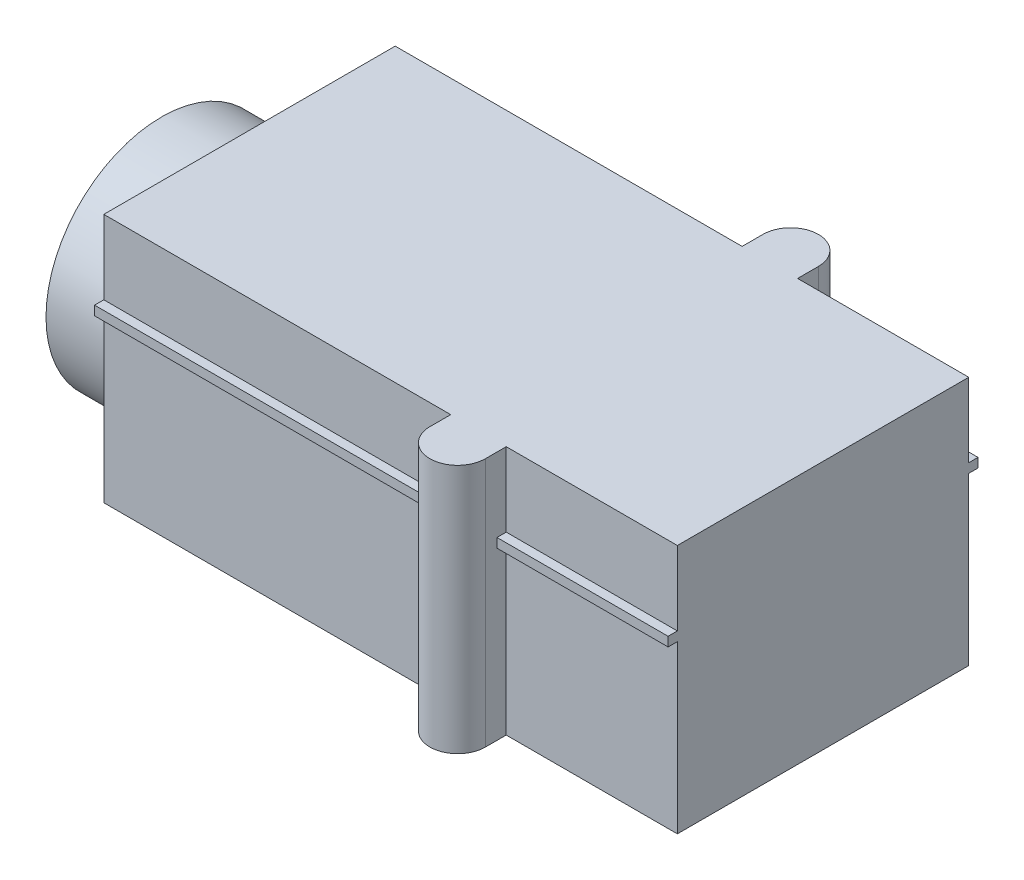
ISO-10303-21;
HEADER;
FILE_DESCRIPTION(('STEP AP214'),'2;1');
FILE_NAME('part.step','',(''),(''),'','','');
FILE_SCHEMA(('AUTOMOTIVE_DESIGN { 1 0 10303 214 1 1 1 1 }'));
ENDSEC;
DATA;
#1=APPLICATION_CONTEXT('core data for automotive mechanical design processes');
#2=APPLICATION_PROTOCOL_DEFINITION('international standard','automotive_design',2000,#1);
#3=PRODUCT_CONTEXT('',#1,'mechanical');
#4=PRODUCT('Part','Part','',(#3));
#5=PRODUCT_RELATED_PRODUCT_CATEGORY('part','',(#4));
#6=PRODUCT_DEFINITION_FORMATION('','',#4);
#7=PRODUCT_DEFINITION_CONTEXT('part definition',#1,'design');
#8=PRODUCT_DEFINITION('design','',#6,#7);
#9=PRODUCT_DEFINITION_SHAPE('','',#8);
#10=(LENGTH_UNIT() NAMED_UNIT(*) SI_UNIT(.MILLI.,.METRE.));
#11=(NAMED_UNIT(*) PLANE_ANGLE_UNIT() SI_UNIT($,.RADIAN.));
#12=(NAMED_UNIT(*) SI_UNIT($,.STERADIAN.) SOLID_ANGLE_UNIT());
#13=UNCERTAINTY_MEASURE_WITH_UNIT(LENGTH_MEASURE(1.E-05),#10,'distance_accuracy_value','');
#14=(GEOMETRIC_REPRESENTATION_CONTEXT(3) GLOBAL_UNCERTAINTY_ASSIGNED_CONTEXT((#13)) GLOBAL_UNIT_ASSIGNED_CONTEXT((#10,
#11,#12)) REPRESENTATION_CONTEXT('',''));
#15=CARTESIAN_POINT('',(0.,0.,0.));
#16=DIRECTION('',(0.,0.,1.));
#17=DIRECTION('',(1.,0.,0.));
#18=AXIS2_PLACEMENT_3D('',#15,#16,#17);
#19=CARTESIAN_POINT('',(7.5,5.4,3.15));
#20=DIRECTION('',(0.,0.,-1.));
#21=DIRECTION('',(-1.,0.,0.));
#22=AXIS2_PLACEMENT_3D('',#19,#20,#21);
#23=PLANE('',#22);
#24=DIRECTION('',(1.,0.,0.));
#25=VECTOR('',#24,1.);
#26=CARTESIAN_POINT('',(7.5,3.6,3.15));
#27=LINE('',#26,#25);
#28=CARTESIAN_POINT('',(0.,3.6,3.15));
#29=VERTEX_POINT('',#28);
#30=CARTESIAN_POINT('',(7.5,3.6,3.15));
#31=VERTEX_POINT('',#30);
#32=EDGE_CURVE('E47',#29,#31,#27,.T.);
#33=ORIENTED_EDGE('',*,*,#32,.F.);
#34=DIRECTION('',(0.,-1.,0.));
#35=VECTOR('',#34,1.);
#36=CARTESIAN_POINT('',(0.,5.4,3.15));
#37=LINE('',#36,#35);
#38=CARTESIAN_POINT('',(0.,0.,3.15));
#39=VERTEX_POINT('',#38);
#40=EDGE_CURVE('E354',#29,#39,#37,.T.);
#41=ORIENTED_EDGE('',*,*,#40,.T.);
#42=DIRECTION('',(1.,0.,0.));
#43=VECTOR('',#42,1.);
#44=CARTESIAN_POINT('',(7.5,0.,3.15));
#45=LINE('',#44,#43);
#46=CARTESIAN_POINT('',(7.5,0.,3.15));
#47=VERTEX_POINT('',#46);
#48=EDGE_CURVE('E324',#39,#47,#45,.T.);
#49=ORIENTED_EDGE('',*,*,#48,.T.);
#50=DIRECTION('',(0.,-1.,0.));
#51=VECTOR('',#50,1.);
#52=CARTESIAN_POINT('',(7.5,5.4,3.15));
#53=LINE('',#52,#51);
#54=EDGE_CURVE('E421',#31,#47,#53,.T.);
#55=ORIENTED_EDGE('',*,*,#54,.F.);
#56=EDGE_LOOP('',(#33,#41,#49,#55));
#57=FACE_BOUND('',#56,.T.);
#58=ADVANCED_FACE('F32',(#57),#23,.F.);
#59=CARTESIAN_POINT('',(12.4,5.4,3.15));
#60=DIRECTION('',(0.,0.,-1.));
#61=DIRECTION('',(-1.,0.,0.));
#62=AXIS2_PLACEMENT_3D('',#59,#60,#61);
#63=PLANE('',#62);
#64=DIRECTION('',(1.,0.,0.));
#65=VECTOR('',#64,1.);
#66=CARTESIAN_POINT('',(12.4,3.6,3.15));
#67=LINE('',#66,#65);
#68=CARTESIAN_POINT('',(8.7,3.6,3.15));
#69=VERTEX_POINT('',#68);
#70=CARTESIAN_POINT('',(12.4,3.6,3.15));
#71=VERTEX_POINT('',#70);
#72=EDGE_CURVE('E293',#69,#71,#67,.T.);
#73=ORIENTED_EDGE('',*,*,#72,.F.);
#74=DIRECTION('',(0.,-1.,0.));
#75=VECTOR('',#74,1.);
#76=CARTESIAN_POINT('',(8.7,5.4,3.15));
#77=LINE('',#76,#75);
#78=CARTESIAN_POINT('',(8.7,0.,3.15));
#79=VERTEX_POINT('',#78);
#80=EDGE_CURVE('E411',#69,#79,#77,.T.);
#81=ORIENTED_EDGE('',*,*,#80,.T.);
#82=DIRECTION('',(1.,0.,0.));
#83=VECTOR('',#82,1.);
#84=CARTESIAN_POINT('',(12.4,0.,3.15));
#85=LINE('',#84,#83);
#86=CARTESIAN_POINT('',(12.4,0.,3.15));
#87=VERTEX_POINT('',#86);
#88=EDGE_CURVE('E364',#79,#87,#85,.T.);
#89=ORIENTED_EDGE('',*,*,#88,.T.);
#90=DIRECTION('',(0.,-1.,0.));
#91=VECTOR('',#90,1.);
#92=CARTESIAN_POINT('',(12.4,5.4,3.15));
#93=LINE('',#92,#91);
#94=EDGE_CURVE('E407',#71,#87,#93,.T.);
#95=ORIENTED_EDGE('',*,*,#94,.F.);
#96=EDGE_LOOP('',(#73,#81,#89,#95));
#97=FACE_BOUND('',#96,.T.);
#98=ADVANCED_FACE('F501',(#97),#63,.F.);
#99=CARTESIAN_POINT('',(8.7,5.4,-3.15));
#100=DIRECTION('',(0.,0.,1.));
#101=DIRECTION('',(1.,0.,0.));
#102=AXIS2_PLACEMENT_3D('',#99,#100,#101);
#103=PLANE('',#102);
#104=DIRECTION('',(-1.,0.,0.));
#105=VECTOR('',#104,1.);
#106=CARTESIAN_POINT('',(8.7,3.6,-3.15));
#107=LINE('',#106,#105);
#108=CARTESIAN_POINT('',(12.4,3.6,-3.15));
#109=VERTEX_POINT('',#108);
#110=CARTESIAN_POINT('',(8.7,3.6,-3.15));
#111=VERTEX_POINT('',#110);
#112=EDGE_CURVE('E290',#109,#111,#107,.T.);
#113=ORIENTED_EDGE('',*,*,#112,.F.);
#114=DIRECTION('',(0.,-1.,0.));
#115=VECTOR('',#114,1.);
#116=CARTESIAN_POINT('',(12.4,5.4,-3.15));
#117=LINE('',#116,#115);
#118=CARTESIAN_POINT('',(12.4,0.,-3.15));
#119=VERTEX_POINT('',#118);
#120=EDGE_CURVE('E404',#109,#119,#117,.T.);
#121=ORIENTED_EDGE('',*,*,#120,.T.);
#122=DIRECTION('',(-1.,0.,0.));
#123=VECTOR('',#122,1.);
#124=CARTESIAN_POINT('',(8.7,0.,-3.15));
#125=LINE('',#124,#123);
#126=CARTESIAN_POINT('',(8.7,0.,-3.15));
#127=VERTEX_POINT('',#126);
#128=EDGE_CURVE('E370',#119,#127,#125,.T.);
#129=ORIENTED_EDGE('',*,*,#128,.T.);
#130=DIRECTION('',(0.,-1.,0.));
#131=VECTOR('',#130,1.);
#132=CARTESIAN_POINT('',(8.7,5.4,-3.15));
#133=LINE('',#132,#131);
#134=EDGE_CURVE('E400',#111,#127,#133,.T.);
#135=ORIENTED_EDGE('',*,*,#134,.F.);
#136=EDGE_LOOP('',(#113,#121,#129,#135));
#137=FACE_BOUND('',#136,.T.);
#138=ADVANCED_FACE('F491',(#137),#103,.F.);
#139=CARTESIAN_POINT('',(0.,5.4,-3.15));
#140=DIRECTION('',(0.,0.,1.));
#141=DIRECTION('',(1.,0.,0.));
#142=AXIS2_PLACEMENT_3D('',#139,#140,#141);
#143=PLANE('',#142);
#144=DIRECTION('',(-1.,0.,0.));
#145=VECTOR('',#144,1.);
#146=CARTESIAN_POINT('',(0.,3.6,-3.15));
#147=LINE('',#146,#145);
#148=CARTESIAN_POINT('',(7.5,3.6,-3.15));
#149=VERTEX_POINT('',#148);
#150=CARTESIAN_POINT('',(0.,3.6,-3.15));
#151=VERTEX_POINT('',#150);
#152=EDGE_CURVE('E425',#149,#151,#147,.T.);
#153=ORIENTED_EDGE('',*,*,#152,.F.);
#154=DIRECTION('',(0.,-1.,0.));
#155=VECTOR('',#154,1.);
#156=CARTESIAN_POINT('',(7.5,5.4,-3.15));
#157=LINE('',#156,#155);
#158=CARTESIAN_POINT('',(7.5,0.,-3.15));
#159=VERTEX_POINT('',#158);
#160=EDGE_CURVE('E390',#149,#159,#157,.T.);
#161=ORIENTED_EDGE('',*,*,#160,.T.);
#162=DIRECTION('',(-1.,0.,0.));
#163=VECTOR('',#162,1.);
#164=CARTESIAN_POINT('',(0.,0.,-3.15));
#165=LINE('',#164,#163);
#166=CARTESIAN_POINT('',(0.,0.,-3.15));
#167=VERTEX_POINT('',#166);
#168=EDGE_CURVE('E380',#159,#167,#165,.T.);
#169=ORIENTED_EDGE('',*,*,#168,.T.);
#170=DIRECTION('',(0.,-1.,0.));
#171=VECTOR('',#170,1.);
#172=CARTESIAN_POINT('',(0.,5.4,-3.15));
#173=LINE('',#172,#171);
#174=EDGE_CURVE('E388',#151,#167,#173,.T.);
#175=ORIENTED_EDGE('',*,*,#174,.F.);
#176=EDGE_LOOP('',(#153,#161,#169,#175));
#177=FACE_BOUND('',#176,.T.);
#178=ADVANCED_FACE('F439',(#177),#143,.F.);
#179=CARTESIAN_POINT('',(0.,5.4,3.15));
#180=DIRECTION('',(1.,0.,0.));
#181=DIRECTION('',(0.,0.,-1.));
#182=AXIS2_PLACEMENT_3D('',#179,#180,#181);
#183=PLANE('',#182);
#184=CARTESIAN_POINT('',(0.,5.4,-3.15));
#185=VERTEX_POINT('',#184);
#186=CARTESIAN_POINT('',(0.,3.8,-3.15));
#187=VERTEX_POINT('',#186);
#188=EDGE_CURVE('E233',#185,#187,#173,.T.);
#189=ORIENTED_EDGE('',*,*,#188,.T.);
#190=DIRECTION('',(0.,0.,-1.));
#191=VECTOR('',#190,1.);
#192=CARTESIAN_POINT('',(0.,3.8,-3.35));
#193=LINE('',#192,#191);
#194=CARTESIAN_POINT('',(0.,3.8,-3.35));
#195=VERTEX_POINT('',#194);
#196=EDGE_CURVE('E225',#187,#195,#193,.T.);
#197=ORIENTED_EDGE('',*,*,#196,.T.);
#198=DIRECTION('',(0.,-1.,0.));
#199=VECTOR('',#198,1.);
#200=CARTESIAN_POINT('',(0.,3.8,-3.35));
#201=LINE('',#200,#199);
#202=CARTESIAN_POINT('',(0.,3.6,-3.35));
#203=VERTEX_POINT('',#202);
#204=EDGE_CURVE('E229',#195,#203,#201,.T.);
#205=ORIENTED_EDGE('',*,*,#204,.T.);
#206=DIRECTION('',(0.,0.,-1.));
#207=VECTOR('',#206,1.);
#208=CARTESIAN_POINT('',(0.,3.6,-3.35));
#209=LINE('',#208,#207);
#210=EDGE_CURVE('E267',#151,#203,#209,.T.);
#211=ORIENTED_EDGE('',*,*,#210,.F.);
#212=ORIENTED_EDGE('',*,*,#174,.T.);
#213=DIRECTION('',(0.,0.,1.));
#214=VECTOR('',#213,1.);
#215=CARTESIAN_POINT('',(0.,0.,3.15));
#216=LINE('',#215,#214);
#217=CARTESIAN_POINT('',(0.,0.,-1.18743420870379));
#218=VERTEX_POINT('',#217);
#219=EDGE_CURVE('E332',#167,#218,#216,.T.);
#220=ORIENTED_EDGE('',*,*,#219,.T.);
#221=CARTESIAN_POINT('',(0.,2.2,0.));
#222=DIRECTION('',(-1.,0.,0.));
#223=DIRECTION('',(0.,0.,1.));
#224=AXIS2_PLACEMENT_3D('',#221,#222,#223);
#225=CIRCLE('',#224,2.5);
#226=CARTESIAN_POINT('',(0.,0.,1.18743420870379));
#227=VERTEX_POINT('',#226);
#228=EDGE_CURVE('E327',#227,#218,#225,.T.);
#229=ORIENTED_EDGE('',*,*,#228,.F.);
#230=EDGE_CURVE('E383',#227,#39,#216,.T.);
#231=ORIENTED_EDGE('',*,*,#230,.T.);
#232=ORIENTED_EDGE('',*,*,#40,.F.);
#233=CARTESIAN_POINT('',(0.,3.6,3.35));
#234=VERTEX_POINT('',#233);
#235=EDGE_CURVE('E263',#234,#29,#209,.T.);
#236=ORIENTED_EDGE('',*,*,#235,.F.);
#237=DIRECTION('',(0.,-1.,0.));
#238=VECTOR('',#237,1.);
#239=CARTESIAN_POINT('',(0.,3.8,3.35));
#240=LINE('',#239,#238);
#241=CARTESIAN_POINT('',(0.,3.8,3.35));
#242=VERTEX_POINT('',#241);
#243=EDGE_CURVE('E276',#242,#234,#240,.T.);
#244=ORIENTED_EDGE('',*,*,#243,.F.);
#245=CARTESIAN_POINT('',(0.,3.8,3.15));
#246=VERTEX_POINT('',#245);
#247=EDGE_CURVE('E237',#242,#246,#193,.T.);
#248=ORIENTED_EDGE('',*,*,#247,.T.);
#249=CARTESIAN_POINT('',(0.,5.4,3.15));
#250=VERTEX_POINT('',#249);
#251=EDGE_CURVE('E55',#250,#246,#37,.T.);
#252=ORIENTED_EDGE('',*,*,#251,.F.);
#253=DIRECTION('',(0.,0.,1.));
#254=VECTOR('',#253,1.);
#255=CARTESIAN_POINT('',(0.,5.4,3.15));
#256=LINE('',#255,#254);
#257=EDGE_CURVE('E352',#185,#250,#256,.T.);
#258=ORIENTED_EDGE('',*,*,#257,.F.);
#259=EDGE_LOOP('',(#189,#197,#205,#211,#212,#220,#229,#231,#232,#236,#244,#248,#252,#258));
#260=FACE_BOUND('',#259,.T.);
#261=ADVANCED_FACE('F227',(#260),#183,.F.);
#262=ORIENTED_EDGE('',*,*,#251,.T.);
#263=DIRECTION('',(1.,0.,0.));
#264=VECTOR('',#263,1.);
#265=CARTESIAN_POINT('',(7.5,3.8,3.15));
#266=LINE('',#265,#264);
#267=CARTESIAN_POINT('',(7.5,3.8,3.15));
#268=VERTEX_POINT('',#267);
#269=EDGE_CURVE('E314',#246,#268,#266,.T.);
#270=ORIENTED_EDGE('',*,*,#269,.T.);
#271=CARTESIAN_POINT('',(7.5,5.4,3.15));
#272=VERTEX_POINT('',#271);
#273=EDGE_CURVE('E422',#272,#268,#53,.T.);
#274=ORIENTED_EDGE('',*,*,#273,.F.);
#275=DIRECTION('',(1.,0.,0.));
#276=VECTOR('',#275,1.);
#277=CARTESIAN_POINT('',(7.5,5.4,3.15));
#278=LINE('',#277,#276);
#279=EDGE_CURVE('E328',#250,#272,#278,.T.);
#280=ORIENTED_EDGE('',*,*,#279,.F.);
#281=EDGE_LOOP('',(#262,#270,#274,#280));
#282=FACE_BOUND('',#281,.T.);
#283=ADVANCED_FACE('F34',(#282),#23,.F.);
#284=CARTESIAN_POINT('',(7.5,5.4,3.15));
#285=DIRECTION('',(1.,0.,0.));
#286=DIRECTION('',(0.,0.,-1.));
#287=AXIS2_PLACEMENT_3D('',#284,#285,#286);
#288=PLANE('',#287);
#289=ORIENTED_EDGE('',*,*,#273,.T.);
#290=DIRECTION('',(0.,0.,1.));
#291=VECTOR('',#290,1.);
#292=CARTESIAN_POINT('',(7.5,3.8,3.15));
#293=LINE('',#292,#291);
#294=CARTESIAN_POINT('',(7.5,3.8,3.35));
#295=VERTEX_POINT('',#294);
#296=EDGE_CURVE('E312',#268,#295,#293,.T.);
#297=ORIENTED_EDGE('',*,*,#296,.T.);
#298=DIRECTION('',(0.,-1.,0.));
#299=VECTOR('',#298,1.);
#300=CARTESIAN_POINT('',(7.5,5.4,3.35));
#301=LINE('',#300,#299);
#302=CARTESIAN_POINT('',(7.5,3.6,3.35));
#303=VERTEX_POINT('',#302);
#304=EDGE_CURVE('E318',#295,#303,#301,.T.);
#305=ORIENTED_EDGE('',*,*,#304,.T.);
#306=DIRECTION('',(0.,0.,1.));
#307=VECTOR('',#306,1.);
#308=CARTESIAN_POINT('',(7.5,3.6,3.15));
#309=LINE('',#308,#307);
#310=EDGE_CURVE('E299',#31,#303,#309,.T.);
#311=ORIENTED_EDGE('',*,*,#310,.F.);
#312=ORIENTED_EDGE('',*,*,#54,.T.);
#313=DIRECTION('',(0.,0.,1.));
#314=VECTOR('',#313,1.);
#315=CARTESIAN_POINT('',(7.5,0.,3.15));
#316=LINE('',#315,#314);
#317=CARTESIAN_POINT('',(7.5,0.,3.6));
#318=VERTEX_POINT('',#317);
#319=EDGE_CURVE('E357',#47,#318,#316,.T.);
#320=ORIENTED_EDGE('',*,*,#319,.T.);
#321=DIRECTION('',(0.,-1.,0.));
#322=VECTOR('',#321,1.);
#323=CARTESIAN_POINT('',(7.5,5.4,3.6));
#324=LINE('',#323,#322);
#325=CARTESIAN_POINT('',(7.5,5.4,3.6));
#326=VERTEX_POINT('',#325);
#327=EDGE_CURVE('E418',#326,#318,#324,.T.);
#328=ORIENTED_EDGE('',*,*,#327,.F.);
#329=DIRECTION('',(0.,0.,1.));
#330=VECTOR('',#329,1.);
#331=CARTESIAN_POINT('',(7.5,5.4,3.15));
#332=LINE('',#331,#330);
#333=EDGE_CURVE('E331',#272,#326,#332,.T.);
#334=ORIENTED_EDGE('',*,*,#333,.F.);
#335=EDGE_LOOP('',(#289,#297,#305,#311,#312,#320,#328,#334));
#336=FACE_BOUND('',#335,.T.);
#337=ADVANCED_FACE('F468',(#336),#288,.F.);
#338=CARTESIAN_POINT('',(8.1,5.4,3.6));
#339=DIRECTION('',(0.,-1.,0.));
#340=DIRECTION('',(0.,0.,-1.));
#341=AXIS2_PLACEMENT_3D('',#338,#339,#340);
#342=CYLINDRICAL_SURFACE('',#341,0.600000000000002);
#343=CARTESIAN_POINT('',(8.1,0.,3.6));
#344=DIRECTION('',(0.,1.,0.));
#345=DIRECTION('',(0.,0.,-1.));
#346=AXIS2_PLACEMENT_3D('',#343,#344,#345);
#347=CIRCLE('',#346,0.600000000000002);
#348=CARTESIAN_POINT('',(8.7,0.,3.6));
#349=VERTEX_POINT('',#348);
#350=EDGE_CURVE('E359',#318,#349,#347,.T.);
#351=ORIENTED_EDGE('',*,*,#350,.T.);
#352=DIRECTION('',(0.,-1.,0.));
#353=VECTOR('',#352,1.);
#354=CARTESIAN_POINT('',(8.7,5.4,3.6));
#355=LINE('',#354,#353);
#356=CARTESIAN_POINT('',(8.7,5.4,3.6));
#357=VERTEX_POINT('',#356);
#358=EDGE_CURVE('E415',#357,#349,#355,.T.);
#359=ORIENTED_EDGE('',*,*,#358,.F.);
#360=CARTESIAN_POINT('',(8.1,5.4,3.6));
#361=DIRECTION('',(0.,1.,0.));
#362=DIRECTION('',(0.,0.,-1.));
#363=AXIS2_PLACEMENT_3D('',#360,#361,#362);
#364=CIRCLE('',#363,0.600000000000002);
#365=EDGE_CURVE('E334',#326,#357,#364,.T.);
#366=ORIENTED_EDGE('',*,*,#365,.F.);
#367=ORIENTED_EDGE('',*,*,#327,.T.);
#368=EDGE_LOOP('',(#351,#359,#366,#367));
#369=FACE_BOUND('',#368,.T.);
#370=ADVANCED_FACE('F508',(#369),#342,.T.);
#371=CARTESIAN_POINT('',(8.7,5.4,3.6));
#372=DIRECTION('',(-1.,0.,0.));
#373=DIRECTION('',(0.,0.,1.));
#374=AXIS2_PLACEMENT_3D('',#371,#372,#373);
#375=PLANE('',#374);
#376=DIRECTION('',(0.,1.,0.));
#377=VECTOR('',#376,1.);
#378=CARTESIAN_POINT('',(8.7,5.4,3.35));
#379=LINE('',#378,#377);
#380=CARTESIAN_POINT('',(8.7,3.6,3.35));
#381=VERTEX_POINT('',#380);
#382=CARTESIAN_POINT('',(8.7,3.8,3.35));
#383=VERTEX_POINT('',#382);
#384=EDGE_CURVE('E11',#381,#383,#379,.T.);
#385=ORIENTED_EDGE('',*,*,#384,.T.);
#386=DIRECTION('',(0.,0.,-1.));
#387=VECTOR('',#386,1.);
#388=CARTESIAN_POINT('',(8.7,3.8,3.6));
#389=LINE('',#388,#387);
#390=CARTESIAN_POINT('',(8.7,3.8,3.15));
#391=VERTEX_POINT('',#390);
#392=EDGE_CURVE('E310',#383,#391,#389,.T.);
#393=ORIENTED_EDGE('',*,*,#392,.T.);
#394=CARTESIAN_POINT('',(8.7,5.4,3.15));
#395=VERTEX_POINT('',#394);
#396=EDGE_CURVE('E412',#395,#391,#77,.T.);
#397=ORIENTED_EDGE('',*,*,#396,.F.);
#398=DIRECTION('',(0.,0.,-1.));
#399=VECTOR('',#398,1.);
#400=CARTESIAN_POINT('',(8.7,5.4,3.6));
#401=LINE('',#400,#399);
#402=EDGE_CURVE('E336',#357,#395,#401,.T.);
#403=ORIENTED_EDGE('',*,*,#402,.F.);
#404=ORIENTED_EDGE('',*,*,#358,.T.);
#405=DIRECTION('',(0.,0.,-1.));
#406=VECTOR('',#405,1.);
#407=CARTESIAN_POINT('',(8.7,0.,3.6));
#408=LINE('',#407,#406);
#409=EDGE_CURVE('E361',#349,#79,#408,.T.);
#410=ORIENTED_EDGE('',*,*,#409,.T.);
#411=ORIENTED_EDGE('',*,*,#80,.F.);
#412=DIRECTION('',(0.,0.,-1.));
#413=VECTOR('',#412,1.);
#414=CARTESIAN_POINT('',(8.7,3.6,3.6));
#415=LINE('',#414,#413);
#416=EDGE_CURVE('E296',#381,#69,#415,.T.);
#417=ORIENTED_EDGE('',*,*,#416,.F.);
#418=EDGE_LOOP('',(#385,#393,#397,#403,#404,#410,#411,#417));
#419=FACE_BOUND('',#418,.T.);
#420=ADVANCED_FACE('F504',(#419),#375,.F.);
#421=ORIENTED_EDGE('',*,*,#396,.T.);
#422=DIRECTION('',(1.,0.,0.));
#423=VECTOR('',#422,1.);
#424=CARTESIAN_POINT('',(12.4,3.8,3.15));
#425=LINE('',#424,#423);
#426=CARTESIAN_POINT('',(12.4,3.8,3.15));
#427=VERTEX_POINT('',#426);
#428=EDGE_CURVE('E308',#391,#427,#425,.T.);
#429=ORIENTED_EDGE('',*,*,#428,.T.);
#430=CARTESIAN_POINT('',(12.4,5.4,3.15));
#431=VERTEX_POINT('',#430);
#432=EDGE_CURVE('E408',#431,#427,#93,.T.);
#433=ORIENTED_EDGE('',*,*,#432,.F.);
#434=DIRECTION('',(1.,0.,0.));
#435=VECTOR('',#434,1.);
#436=CARTESIAN_POINT('',(12.4,5.4,3.15));
#437=LINE('',#436,#435);
#438=EDGE_CURVE('E338',#395,#431,#437,.T.);
#439=ORIENTED_EDGE('',*,*,#438,.F.);
#440=EDGE_LOOP('',(#421,#429,#433,#439));
#441=FACE_BOUND('',#440,.T.);
#442=ADVANCED_FACE('F515',(#441),#63,.F.);
#443=CARTESIAN_POINT('',(12.4,5.4,-3.15));
#444=DIRECTION('',(-1.,0.,0.));
#445=DIRECTION('',(0.,0.,1.));
#446=AXIS2_PLACEMENT_3D('',#443,#444,#445);
#447=PLANE('',#446);
#448=ORIENTED_EDGE('',*,*,#432,.T.);
#449=DIRECTION('',(0.,0.,1.));
#450=VECTOR('',#449,1.);
#451=CARTESIAN_POINT('',(12.4,3.8,-3.35));
#452=LINE('',#451,#450);
#453=CARTESIAN_POINT('',(12.4,3.8,3.35));
#454=VERTEX_POINT('',#453);
#455=EDGE_CURVE('E253',#427,#454,#452,.T.);
#456=ORIENTED_EDGE('',*,*,#455,.T.);
#457=DIRECTION('',(0.,-1.,0.));
#458=VECTOR('',#457,1.);
#459=CARTESIAN_POINT('',(12.4,3.8,3.35));
#460=LINE('',#459,#458);
#461=CARTESIAN_POINT('',(12.4,3.6,3.35));
#462=VERTEX_POINT('',#461);
#463=EDGE_CURVE('E280',#454,#462,#460,.T.);
#464=ORIENTED_EDGE('',*,*,#463,.T.);
#465=DIRECTION('',(0.,0.,1.));
#466=VECTOR('',#465,1.);
#467=CARTESIAN_POINT('',(12.4,3.6,-3.35));
#468=LINE('',#467,#466);
#469=EDGE_CURVE('E269',#71,#462,#468,.T.);
#470=ORIENTED_EDGE('',*,*,#469,.F.);
#471=ORIENTED_EDGE('',*,*,#94,.T.);
#472=DIRECTION('',(0.,0.,-1.));
#473=VECTOR('',#472,1.);
#474=CARTESIAN_POINT('',(12.4,0.,-3.15));
#475=LINE('',#474,#473);
#476=EDGE_CURVE('E367',#87,#119,#475,.T.);
#477=ORIENTED_EDGE('',*,*,#476,.T.);
#478=ORIENTED_EDGE('',*,*,#120,.F.);
#479=CARTESIAN_POINT('',(12.4,3.6,-3.35));
#480=VERTEX_POINT('',#479);
#481=EDGE_CURVE('E270',#480,#109,#468,.T.);
#482=ORIENTED_EDGE('',*,*,#481,.F.);
#483=DIRECTION('',(0.,-1.,0.));
#484=VECTOR('',#483,1.);
#485=CARTESIAN_POINT('',(12.4,3.8,-3.35));
#486=LINE('',#485,#484);
#487=CARTESIAN_POINT('',(12.4,3.8,-3.35));
#488=VERTEX_POINT('',#487);
#489=EDGE_CURVE('E247',#488,#480,#486,.T.);
#490=ORIENTED_EDGE('',*,*,#489,.F.);
#491=CARTESIAN_POINT('',(12.4,3.8,-3.15));
#492=VERTEX_POINT('',#491);
#493=EDGE_CURVE('E256',#488,#492,#452,.T.);
#494=ORIENTED_EDGE('',*,*,#493,.T.);
#495=CARTESIAN_POINT('',(12.4,5.4,-3.15));
#496=VERTEX_POINT('',#495);
#497=EDGE_CURVE('E405',#496,#492,#117,.T.);
#498=ORIENTED_EDGE('',*,*,#497,.F.);
#499=DIRECTION('',(0.,0.,-1.));
#500=VECTOR('',#499,1.);
#501=CARTESIAN_POINT('',(12.4,5.4,-3.15));
#502=LINE('',#501,#500);
#503=EDGE_CURVE('E340',#431,#496,#502,.T.);
#504=ORIENTED_EDGE('',*,*,#503,.F.);
#505=EDGE_LOOP('',(#448,#456,#464,#470,#471,#477,#478,#482,#490,#494,#498,#504));
#506=FACE_BOUND('',#505,.T.);
#507=ADVANCED_FACE('F497',(#506),#447,.F.);
#508=ORIENTED_EDGE('',*,*,#497,.T.);
#509=DIRECTION('',(-1.,0.,0.));
#510=VECTOR('',#509,1.);
#511=CARTESIAN_POINT('',(8.7,3.8,-3.15));
#512=LINE('',#511,#510);
#513=CARTESIAN_POINT('',(8.7,3.8,-3.15));
#514=VERTEX_POINT('',#513);
#515=EDGE_CURVE('E306',#492,#514,#512,.T.);
#516=ORIENTED_EDGE('',*,*,#515,.T.);
#517=CARTESIAN_POINT('',(8.7,5.4,-3.15));
#518=VERTEX_POINT('',#517);
#519=EDGE_CURVE('E401',#518,#514,#133,.T.);
#520=ORIENTED_EDGE('',*,*,#519,.F.);
#521=DIRECTION('',(-1.,0.,0.));
#522=VECTOR('',#521,1.);
#523=CARTESIAN_POINT('',(8.7,5.4,-3.15));
#524=LINE('',#523,#522);
#525=EDGE_CURVE('E342',#496,#518,#524,.T.);
#526=ORIENTED_EDGE('',*,*,#525,.F.);
#527=EDGE_LOOP('',(#508,#516,#520,#526));
#528=FACE_BOUND('',#527,.T.);
#529=ADVANCED_FACE('F522',(#528),#103,.F.);
#530=CARTESIAN_POINT('',(8.7,5.4,-3.6));
#531=DIRECTION('',(-1.,0.,0.));
#532=DIRECTION('',(0.,0.,1.));
#533=AXIS2_PLACEMENT_3D('',#530,#531,#532);
#534=PLANE('',#533);
#535=ORIENTED_EDGE('',*,*,#519,.T.);
#536=DIRECTION('',(0.,0.,-1.));
#537=VECTOR('',#536,1.);
#538=CARTESIAN_POINT('',(8.7,3.8,-3.6));
#539=LINE('',#538,#537);
#540=CARTESIAN_POINT('',(8.7,3.8,-3.35));
#541=VERTEX_POINT('',#540);
#542=EDGE_CURVE('E304',#514,#541,#539,.T.);
#543=ORIENTED_EDGE('',*,*,#542,.T.);
#544=DIRECTION('',(0.,-1.,0.));
#545=VECTOR('',#544,1.);
#546=CARTESIAN_POINT('',(8.7,5.4,-3.35));
#547=LINE('',#546,#545);
#548=CARTESIAN_POINT('',(8.7,3.6,-3.35));
#549=VERTEX_POINT('',#548);
#550=EDGE_CURVE('E316',#541,#549,#547,.T.);
#551=ORIENTED_EDGE('',*,*,#550,.T.);
#552=DIRECTION('',(0.,0.,-1.));
#553=VECTOR('',#552,1.);
#554=CARTESIAN_POINT('',(8.7,3.6,-3.6));
#555=LINE('',#554,#553);
#556=EDGE_CURVE('E287',#111,#549,#555,.T.);
#557=ORIENTED_EDGE('',*,*,#556,.F.);
#558=ORIENTED_EDGE('',*,*,#134,.T.);
#559=DIRECTION('',(0.,0.,-1.));
#560=VECTOR('',#559,1.);
#561=CARTESIAN_POINT('',(8.7,0.,-3.6));
#562=LINE('',#561,#560);
#563=CARTESIAN_POINT('',(8.7,0.,-3.6));
#564=VERTEX_POINT('',#563);
#565=EDGE_CURVE('E373',#127,#564,#562,.T.);
#566=ORIENTED_EDGE('',*,*,#565,.T.);
#567=DIRECTION('',(0.,-1.,0.));
#568=VECTOR('',#567,1.);
#569=CARTESIAN_POINT('',(8.7,5.4,-3.6));
#570=LINE('',#569,#568);
#571=CARTESIAN_POINT('',(8.7,5.4,-3.6));
#572=VERTEX_POINT('',#571);
#573=EDGE_CURVE('E397',#572,#564,#570,.T.);
#574=ORIENTED_EDGE('',*,*,#573,.F.);
#575=DIRECTION('',(0.,0.,-1.));
#576=VECTOR('',#575,1.);
#577=CARTESIAN_POINT('',(8.7,5.4,-3.6));
#578=LINE('',#577,#576);
#579=EDGE_CURVE('E344',#518,#572,#578,.T.);
#580=ORIENTED_EDGE('',*,*,#579,.F.);
#581=EDGE_LOOP('',(#535,#543,#551,#557,#558,#566,#574,#580));
#582=FACE_BOUND('',#581,.T.);
#583=ADVANCED_FACE('F488',(#582),#534,.F.);
#584=CARTESIAN_POINT('',(8.1,5.4,-3.6));
#585=DIRECTION('',(0.,-1.,0.));
#586=DIRECTION('',(0.,0.,-1.));
#587=AXIS2_PLACEMENT_3D('',#584,#585,#586);
#588=CYLINDRICAL_SURFACE('',#587,0.600000000000002);
#589=CARTESIAN_POINT('',(8.1,0.,-3.6));
#590=DIRECTION('',(0.,1.,0.));
#591=DIRECTION('',(0.,0.,-1.));
#592=AXIS2_PLACEMENT_3D('',#589,#590,#591);
#593=CIRCLE('',#592,0.600000000000002);
#594=CARTESIAN_POINT('',(7.5,0.,-3.6));
#595=VERTEX_POINT('',#594);
#596=EDGE_CURVE('E375',#564,#595,#593,.T.);
#597=ORIENTED_EDGE('',*,*,#596,.T.);
#598=DIRECTION('',(0.,-1.,0.));
#599=VECTOR('',#598,1.);
#600=CARTESIAN_POINT('',(7.5,5.4,-3.6));
#601=LINE('',#600,#599);
#602=CARTESIAN_POINT('',(7.5,5.4,-3.6));
#603=VERTEX_POINT('',#602);
#604=EDGE_CURVE('E394',#603,#595,#601,.T.);
#605=ORIENTED_EDGE('',*,*,#604,.F.);
#606=CARTESIAN_POINT('',(8.1,5.4,-3.6));
#607=DIRECTION('',(0.,1.,0.));
#608=DIRECTION('',(0.,0.,-1.));
#609=AXIS2_PLACEMENT_3D('',#606,#607,#608);
#610=CIRCLE('',#609,0.600000000000002);
#611=EDGE_CURVE('E346',#572,#603,#610,.T.);
#612=ORIENTED_EDGE('',*,*,#611,.F.);
#613=ORIENTED_EDGE('',*,*,#573,.T.);
#614=EDGE_LOOP('',(#597,#605,#612,#613));
#615=FACE_BOUND('',#614,.T.);
#616=ADVANCED_FACE('F484',(#615),#588,.T.);
#617=CARTESIAN_POINT('',(7.5,5.4,-3.15));
#618=DIRECTION('',(1.,0.,0.));
#619=DIRECTION('',(0.,0.,-1.));
#620=AXIS2_PLACEMENT_3D('',#617,#618,#619);
#621=PLANE('',#620);
#622=DIRECTION('',(0.,1.,0.));
#623=VECTOR('',#622,1.);
#624=CARTESIAN_POINT('',(7.5,5.4,-3.35));
#625=LINE('',#624,#623);
#626=CARTESIAN_POINT('',(7.5,3.6,-3.35));
#627=VERTEX_POINT('',#626);
#628=CARTESIAN_POINT('',(7.5,3.8,-3.35));
#629=VERTEX_POINT('',#628);
#630=EDGE_CURVE('E40',#627,#629,#625,.T.);
#631=ORIENTED_EDGE('',*,*,#630,.T.);
#632=DIRECTION('',(0.,0.,1.));
#633=VECTOR('',#632,1.);
#634=CARTESIAN_POINT('',(7.5,3.8,-3.15));
#635=LINE('',#634,#633);
#636=CARTESIAN_POINT('',(7.5,3.8,-3.15));
#637=VERTEX_POINT('',#636);
#638=EDGE_CURVE('E252',#629,#637,#635,.T.);
#639=ORIENTED_EDGE('',*,*,#638,.T.);
#640=CARTESIAN_POINT('',(7.5,5.4,-3.15));
#641=VERTEX_POINT('',#640);
#642=EDGE_CURVE('E391',#641,#637,#157,.T.);
#643=ORIENTED_EDGE('',*,*,#642,.F.);
#644=DIRECTION('',(0.,0.,1.));
#645=VECTOR('',#644,1.);
#646=CARTESIAN_POINT('',(7.5,5.4,-3.15));
#647=LINE('',#646,#645);
#648=EDGE_CURVE('E348',#603,#641,#647,.T.);
#649=ORIENTED_EDGE('',*,*,#648,.F.);
#650=ORIENTED_EDGE('',*,*,#604,.T.);
#651=DIRECTION('',(0.,0.,1.));
#652=VECTOR('',#651,1.);
#653=CARTESIAN_POINT('',(7.5,0.,-3.15));
#654=LINE('',#653,#652);
#655=EDGE_CURVE('E377',#595,#159,#654,.T.);
#656=ORIENTED_EDGE('',*,*,#655,.T.);
#657=ORIENTED_EDGE('',*,*,#160,.F.);
#658=DIRECTION('',(0.,0.,1.));
#659=VECTOR('',#658,1.);
#660=CARTESIAN_POINT('',(7.5,3.6,-3.15));
#661=LINE('',#660,#659);
#662=EDGE_CURVE('E279',#627,#149,#661,.T.);
#663=ORIENTED_EDGE('',*,*,#662,.F.);
#664=EDGE_LOOP('',(#631,#639,#643,#649,#650,#656,#657,#663));
#665=FACE_BOUND('',#664,.T.);
#666=ADVANCED_FACE('F430',(#665),#621,.F.);
#667=ORIENTED_EDGE('',*,*,#642,.T.);
#668=DIRECTION('',(-1.,0.,0.));
#669=VECTOR('',#668,1.);
#670=CARTESIAN_POINT('',(0.,3.8,-3.15));
#671=LINE('',#670,#669);
#672=EDGE_CURVE('E428',#637,#187,#671,.T.);
#673=ORIENTED_EDGE('',*,*,#672,.T.);
#674=ORIENTED_EDGE('',*,*,#188,.F.);
#675=DIRECTION('',(-1.,0.,0.));
#676=VECTOR('',#675,1.);
#677=CARTESIAN_POINT('',(0.,5.4,-3.15));
#678=LINE('',#677,#676);
#679=EDGE_CURVE('E350',#641,#185,#678,.T.);
#680=ORIENTED_EDGE('',*,*,#679,.F.);
#681=EDGE_LOOP('',(#667,#673,#674,#680));
#682=FACE_BOUND('',#681,.T.);
#683=ADVANCED_FACE('F477',(#682),#143,.F.);
#684=CARTESIAN_POINT('',(8.1,5.4,-3.6));
#685=DIRECTION('',(0.,-1.,0.));
#686=DIRECTION('',(0.,0.,-1.));
#687=AXIS2_PLACEMENT_3D('',#684,#685,#686);
#688=PLANE('',#687);
#689=ORIENTED_EDGE('',*,*,#279,.T.);
#690=ORIENTED_EDGE('',*,*,#333,.T.);
#691=ORIENTED_EDGE('',*,*,#365,.T.);
#692=ORIENTED_EDGE('',*,*,#402,.T.);
#693=ORIENTED_EDGE('',*,*,#438,.T.);
#694=ORIENTED_EDGE('',*,*,#503,.T.);
#695=ORIENTED_EDGE('',*,*,#525,.T.);
#696=ORIENTED_EDGE('',*,*,#579,.T.);
#697=ORIENTED_EDGE('',*,*,#611,.T.);
#698=ORIENTED_EDGE('',*,*,#648,.T.);
#699=ORIENTED_EDGE('',*,*,#679,.T.);
#700=ORIENTED_EDGE('',*,*,#257,.T.);
#701=EDGE_LOOP('',(#689,#690,#691,#692,#693,#694,#695,#696,#697,#698,#699,#700));
#702=FACE_BOUND('',#701,.T.);
#703=ADVANCED_FACE('F473',(#702),#688,.F.);
#704=CARTESIAN_POINT('',(8.1,0.,-3.6));
#705=DIRECTION('',(0.,-1.,0.));
#706=DIRECTION('',(0.,0.,-1.));
#707=AXIS2_PLACEMENT_3D('',#704,#705,#706);
#708=PLANE('',#707);
#709=ORIENTED_EDGE('',*,*,#48,.F.);
#710=ORIENTED_EDGE('',*,*,#230,.F.);
#711=EDGE_CURVE('E386',#218,#227,#216,.T.);
#712=ORIENTED_EDGE('',*,*,#711,.F.);
#713=ORIENTED_EDGE('',*,*,#219,.F.);
#714=ORIENTED_EDGE('',*,*,#168,.F.);
#715=ORIENTED_EDGE('',*,*,#655,.F.);
#716=ORIENTED_EDGE('',*,*,#596,.F.);
#717=ORIENTED_EDGE('',*,*,#565,.F.);
#718=ORIENTED_EDGE('',*,*,#128,.F.);
#719=ORIENTED_EDGE('',*,*,#476,.F.);
#720=ORIENTED_EDGE('',*,*,#88,.F.);
#721=ORIENTED_EDGE('',*,*,#409,.F.);
#722=ORIENTED_EDGE('',*,*,#350,.F.);
#723=ORIENTED_EDGE('',*,*,#319,.F.);
#724=EDGE_LOOP('',(#709,#710,#712,#713,#714,#715,#716,#717,#718,#719,#720,#721,#722,#723));
#725=FACE_BOUND('',#724,.T.);
#726=ADVANCED_FACE('F443',(#725),#708,.T.);
#727=CARTESIAN_POINT('',(0.,2.2,0.));
#728=DIRECTION('',(-1.,0.,0.));
#729=DIRECTION('',(0.,0.,1.));
#730=AXIS2_PLACEMENT_3D('',#727,#728,#729);
#731=PLANE('',#730);
#732=EDGE_CURVE('E320',#218,#227,#225,.T.);
#733=ORIENTED_EDGE('',*,*,#732,.F.);
#734=ORIENTED_EDGE('',*,*,#711,.T.);
#735=EDGE_LOOP('',(#733,#734));
#736=FACE_BOUND('',#735,.T.);
#737=ADVANCED_FACE('F449',(#736),#731,.F.);
#738=CARTESIAN_POINT('',(-1.9,2.2,0.));
#739=DIRECTION('',(1.,0.,0.));
#740=DIRECTION('',(0.,0.,-1.));
#741=AXIS2_PLACEMENT_3D('',#738,#739,#740);
#742=CYLINDRICAL_SURFACE('',#741,2.5);
#743=CARTESIAN_POINT('',(-1.9,2.2,0.));
#744=DIRECTION('',(-1.,0.,0.));
#745=DIRECTION('',(0.,0.,1.));
#746=AXIS2_PLACEMENT_3D('',#743,#744,#745);
#747=CIRCLE('',#746,2.5);
#748=CARTESIAN_POINT('',(-1.9,2.2,2.5));
#749=VERTEX_POINT('',#748);
#750=EDGE_CURVE('E321',#749,#749,#747,.T.);
#751=ORIENTED_EDGE('',*,*,#750,.F.);
#752=EDGE_LOOP('',(#751));
#753=FACE_BOUND('',#752,.T.);
#754=ORIENTED_EDGE('',*,*,#732,.T.);
#755=ORIENTED_EDGE('',*,*,#228,.T.);
#756=EDGE_LOOP('',(#754,#755));
#757=FACE_BOUND('',#756,.T.);
#758=ADVANCED_FACE('F451',(#753,#757),#742,.T.);
#759=CARTESIAN_POINT('',(-1.9,2.2,0.));
#760=DIRECTION('',(-1.,0.,0.));
#761=DIRECTION('',(0.,0.,1.));
#762=AXIS2_PLACEMENT_3D('',#759,#760,#761);
#763=PLANE('',#762);
#764=ORIENTED_EDGE('',*,*,#750,.T.);
#765=EDGE_LOOP('',(#764));
#766=FACE_BOUND('',#765,.T.);
#767=ADVANCED_FACE('F548',(#766),#763,.T.);
#768=CARTESIAN_POINT('',(0.,3.6,0.));
#769=DIRECTION('',(0.,1.,0.));
#770=DIRECTION('',(0.,0.,1.));
#771=AXIS2_PLACEMENT_3D('',#768,#769,#770);
#772=PLANE('',#771);
#773=DIRECTION('',(1.,0.,0.));
#774=VECTOR('',#773,1.);
#775=CARTESIAN_POINT('',(0.,3.6,-3.35));
#776=LINE('',#775,#774);
#777=EDGE_CURVE('E246',#203,#627,#776,.T.);
#778=ORIENTED_EDGE('',*,*,#777,.T.);
#779=ORIENTED_EDGE('',*,*,#662,.T.);
#780=ORIENTED_EDGE('',*,*,#152,.T.);
#781=ORIENTED_EDGE('',*,*,#210,.T.);
#782=EDGE_LOOP('',(#778,#779,#780,#781));
#783=FACE_BOUND('',#782,.T.);
#784=ADVANCED_FACE('F434',(#783),#772,.F.);
#785=CARTESIAN_POINT('',(0.,3.8,0.));
#786=DIRECTION('',(0.,1.,0.));
#787=DIRECTION('',(0.,0.,1.));
#788=AXIS2_PLACEMENT_3D('',#785,#786,#787);
#789=PLANE('',#788);
#790=ORIENTED_EDGE('',*,*,#638,.F.);
#791=DIRECTION('',(1.,0.,0.));
#792=VECTOR('',#791,1.);
#793=CARTESIAN_POINT('',(0.,3.8,-3.35));
#794=LINE('',#793,#792);
#795=EDGE_CURVE('E244',#195,#629,#794,.T.);
#796=ORIENTED_EDGE('',*,*,#795,.F.);
#797=ORIENTED_EDGE('',*,*,#196,.F.);
#798=ORIENTED_EDGE('',*,*,#672,.F.);
#799=EDGE_LOOP('',(#790,#796,#797,#798));
#800=FACE_BOUND('',#799,.T.);
#801=ADVANCED_FACE('F251',(#800),#789,.T.);
#802=CARTESIAN_POINT('',(0.,3.8,-3.35));
#803=DIRECTION('',(0.,0.,-1.));
#804=DIRECTION('',(-1.,0.,0.));
#805=AXIS2_PLACEMENT_3D('',#802,#803,#804);
#806=PLANE('',#805);
#807=ORIENTED_EDGE('',*,*,#630,.F.);
#808=ORIENTED_EDGE('',*,*,#777,.F.);
#809=ORIENTED_EDGE('',*,*,#204,.F.);
#810=ORIENTED_EDGE('',*,*,#795,.T.);
#811=EDGE_LOOP('',(#807,#808,#809,#810));
#812=FACE_BOUND('',#811,.T.);
#813=ADVANCED_FACE('F243',(#812),#806,.T.);
#814=ORIENTED_EDGE('',*,*,#481,.T.);
#815=ORIENTED_EDGE('',*,*,#112,.T.);
#816=ORIENTED_EDGE('',*,*,#556,.T.);
#817=EDGE_CURVE('E266',#549,#480,#776,.T.);
#818=ORIENTED_EDGE('',*,*,#817,.T.);
#819=EDGE_LOOP('',(#814,#815,#816,#818));
#820=FACE_BOUND('',#819,.T.);
#821=ADVANCED_FACE('F535',(#820),#772,.F.);
#822=ORIENTED_EDGE('',*,*,#515,.F.);
#823=ORIENTED_EDGE('',*,*,#493,.F.);
#824=EDGE_CURVE('E254',#541,#488,#794,.T.);
#825=ORIENTED_EDGE('',*,*,#824,.F.);
#826=ORIENTED_EDGE('',*,*,#542,.F.);
#827=EDGE_LOOP('',(#822,#823,#825,#826));
#828=FACE_BOUND('',#827,.T.);
#829=ADVANCED_FACE('F528',(#828),#789,.T.);
#830=ORIENTED_EDGE('',*,*,#550,.F.);
#831=ORIENTED_EDGE('',*,*,#824,.T.);
#832=ORIENTED_EDGE('',*,*,#489,.T.);
#833=ORIENTED_EDGE('',*,*,#817,.F.);
#834=EDGE_LOOP('',(#830,#831,#832,#833));
#835=FACE_BOUND('',#834,.T.);
#836=ADVANCED_FACE('F532',(#835),#806,.T.);
#837=DIRECTION('',(-1.,0.,0.));
#838=VECTOR('',#837,1.);
#839=CARTESIAN_POINT('',(0.,3.6,3.35));
#840=LINE('',#839,#838);
#841=EDGE_CURVE('E238',#462,#381,#840,.T.);
#842=ORIENTED_EDGE('',*,*,#841,.T.);
#843=ORIENTED_EDGE('',*,*,#416,.T.);
#844=ORIENTED_EDGE('',*,*,#72,.T.);
#845=ORIENTED_EDGE('',*,*,#469,.T.);
#846=EDGE_LOOP('',(#842,#843,#844,#845));
#847=FACE_BOUND('',#846,.T.);
#848=ADVANCED_FACE('F538',(#847),#772,.F.);
#849=ORIENTED_EDGE('',*,*,#392,.F.);
#850=DIRECTION('',(-1.,0.,0.));
#851=VECTOR('',#850,1.);
#852=CARTESIAN_POINT('',(0.,3.8,3.35));
#853=LINE('',#852,#851);
#854=EDGE_CURVE('E248',#454,#383,#853,.T.);
#855=ORIENTED_EDGE('',*,*,#854,.F.);
#856=ORIENTED_EDGE('',*,*,#455,.F.);
#857=ORIENTED_EDGE('',*,*,#428,.F.);
#858=EDGE_LOOP('',(#849,#855,#856,#857));
#859=FACE_BOUND('',#858,.T.);
#860=ADVANCED_FACE('F544',(#859),#789,.T.);
#861=CARTESIAN_POINT('',(0.,3.8,3.35));
#862=DIRECTION('',(0.,0.,1.));
#863=DIRECTION('',(1.,0.,0.));
#864=AXIS2_PLACEMENT_3D('',#861,#862,#863);
#865=PLANE('',#864);
#866=ORIENTED_EDGE('',*,*,#384,.F.);
#867=ORIENTED_EDGE('',*,*,#841,.F.);
#868=ORIENTED_EDGE('',*,*,#463,.F.);
#869=ORIENTED_EDGE('',*,*,#854,.T.);
#870=EDGE_LOOP('',(#866,#867,#868,#869));
#871=FACE_BOUND('',#870,.T.);
#872=ADVANCED_FACE('F695',(#871),#865,.T.);
#873=ORIENTED_EDGE('',*,*,#304,.F.);
#874=EDGE_CURVE('E260',#295,#242,#853,.T.);
#875=ORIENTED_EDGE('',*,*,#874,.T.);
#876=ORIENTED_EDGE('',*,*,#243,.T.);
#877=EDGE_CURVE('E273',#303,#234,#840,.T.);
#878=ORIENTED_EDGE('',*,*,#877,.F.);
#879=EDGE_LOOP('',(#873,#875,#876,#878));
#880=FACE_BOUND('',#879,.T.);
#881=ADVANCED_FACE('F704',(#880),#865,.T.);
#882=ORIENTED_EDGE('',*,*,#269,.F.);
#883=ORIENTED_EDGE('',*,*,#247,.F.);
#884=ORIENTED_EDGE('',*,*,#874,.F.);
#885=ORIENTED_EDGE('',*,*,#296,.F.);
#886=EDGE_LOOP('',(#882,#883,#884,#885));
#887=FACE_BOUND('',#886,.T.);
#888=ADVANCED_FACE('F465',(#887),#789,.T.);
#889=ORIENTED_EDGE('',*,*,#235,.T.);
#890=ORIENTED_EDGE('',*,*,#32,.T.);
#891=ORIENTED_EDGE('',*,*,#310,.T.);
#892=ORIENTED_EDGE('',*,*,#877,.T.);
#893=EDGE_LOOP('',(#889,#890,#891,#892));
#894=FACE_BOUND('',#893,.T.);
#895=ADVANCED_FACE('F457',(#894),#772,.F.);
#896=CLOSED_SHELL('',(#58,#98,#138,#178,#261,#283,#337,#370,#420,#442,#507,#529,#583,#616,#666,
#683,#703,#726,#737,#758,#767,#784,#801,#813,#821,#829,#836,#848,#860,#872,#881,#888,#895));
#897=MANIFOLD_SOLID_BREP('B2',#896);
#898=ADVANCED_BREP_SHAPE_REPRESENTATION('',(#18,#897),#14);
#899=SHAPE_DEFINITION_REPRESENTATION(#9,#898);
ENDSEC;
END-ISO-10303-21;
